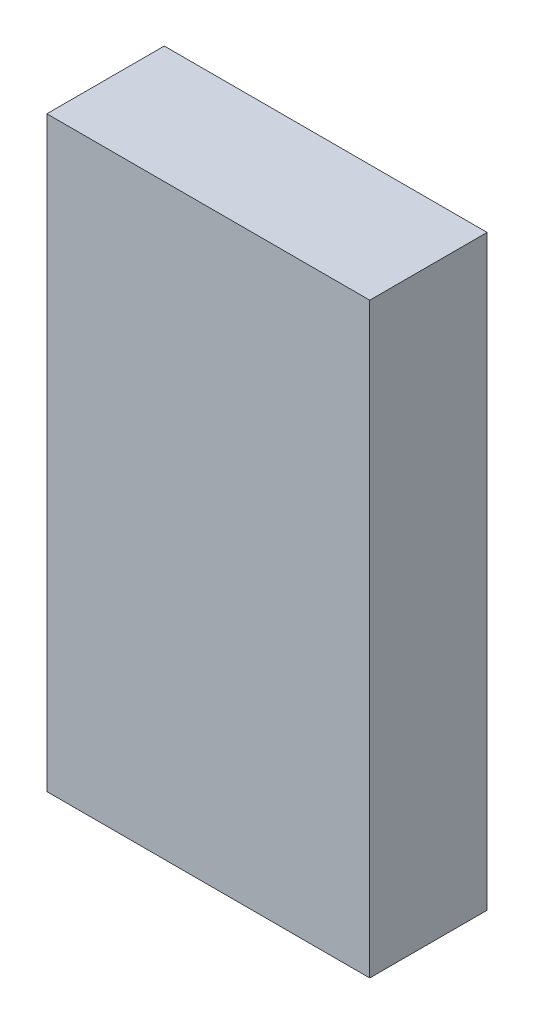
ISO-10303-21;
HEADER;
FILE_DESCRIPTION(('STEP AP214'),'2;1');
FILE_NAME('part.step','',(''),(''),'','','');
FILE_SCHEMA(('AUTOMOTIVE_DESIGN { 1 0 10303 214 1 1 1 1 }'));
ENDSEC;
DATA;
#1=APPLICATION_CONTEXT('core data for automotive mechanical design processes');
#2=APPLICATION_PROTOCOL_DEFINITION('international standard','automotive_design',2000,#1);
#3=PRODUCT_CONTEXT('',#1,'mechanical');
#4=PRODUCT('Part','Part','',(#3));
#5=PRODUCT_RELATED_PRODUCT_CATEGORY('part','',(#4));
#6=PRODUCT_DEFINITION_FORMATION('','',#4);
#7=PRODUCT_DEFINITION_CONTEXT('part definition',#1,'design');
#8=PRODUCT_DEFINITION('design','',#6,#7);
#9=PRODUCT_DEFINITION_SHAPE('','',#8);
#10=(LENGTH_UNIT() NAMED_UNIT(*) SI_UNIT(.MILLI.,.METRE.));
#11=(NAMED_UNIT(*) PLANE_ANGLE_UNIT() SI_UNIT($,.RADIAN.));
#12=(NAMED_UNIT(*) SI_UNIT($,.STERADIAN.) SOLID_ANGLE_UNIT());
#13=UNCERTAINTY_MEASURE_WITH_UNIT(LENGTH_MEASURE(1.E-05),#10,'distance_accuracy_value','');
#14=(GEOMETRIC_REPRESENTATION_CONTEXT(3) GLOBAL_UNCERTAINTY_ASSIGNED_CONTEXT((#13)) GLOBAL_UNIT_ASSIGNED_CONTEXT((#10,
#11,#12)) REPRESENTATION_CONTEXT('',''));
#15=CARTESIAN_POINT('',(0.,0.,0.));
#16=DIRECTION('',(0.,0.,1.));
#17=DIRECTION('',(1.,0.,0.));
#18=AXIS2_PLACEMENT_3D('',#15,#16,#17);
#19=CARTESIAN_POINT('',(-27.5,50.,20.));
#20=DIRECTION('',(1.,0.,0.));
#21=DIRECTION('',(0.,0.,-1.));
#22=AXIS2_PLACEMENT_3D('',#19,#20,#21);
#23=PLANE('',#22);
#24=DIRECTION('',(0.,-1.,0.));
#25=VECTOR('',#24,1.);
#26=CARTESIAN_POINT('',(-27.5,50.,0.));
#27=LINE('',#26,#25);
#28=CARTESIAN_POINT('',(-27.5,50.,0.));
#29=VERTEX_POINT('',#28);
#30=CARTESIAN_POINT('',(-27.5,-50.,0.));
#31=VERTEX_POINT('',#30);
#32=EDGE_CURVE('E96',#29,#31,#27,.T.);
#33=ORIENTED_EDGE('',*,*,#32,.T.);
#34=DIRECTION('',(0.,0.,-1.));
#35=VECTOR('',#34,1.);
#36=CARTESIAN_POINT('',(-27.5,-50.,20.));
#37=LINE('',#36,#35);
#38=CARTESIAN_POINT('',(-27.5,-50.,20.));
#39=VERTEX_POINT('',#38);
#40=EDGE_CURVE('E11',#39,#31,#37,.T.);
#41=ORIENTED_EDGE('',*,*,#40,.F.);
#42=DIRECTION('',(0.,-1.,0.));
#43=VECTOR('',#42,1.);
#44=CARTESIAN_POINT('',(-27.5,50.,20.));
#45=LINE('',#44,#43);
#46=CARTESIAN_POINT('',(-27.5,50.,20.));
#47=VERTEX_POINT('',#46);
#48=EDGE_CURVE('E84',#47,#39,#45,.T.);
#49=ORIENTED_EDGE('',*,*,#48,.F.);
#50=DIRECTION('',(0.,0.,-1.));
#51=VECTOR('',#50,1.);
#52=CARTESIAN_POINT('',(-27.5,50.,20.));
#53=LINE('',#52,#51);
#54=EDGE_CURVE('E92',#47,#29,#53,.T.);
#55=ORIENTED_EDGE('',*,*,#54,.T.);
#56=EDGE_LOOP('',(#33,#41,#49,#55));
#57=FACE_BOUND('',#56,.T.);
#58=ADVANCED_FACE('F33',(#57),#23,.F.);
#59=CARTESIAN_POINT('',(27.5,-50.,20.));
#60=DIRECTION('',(0.,1.,0.));
#61=DIRECTION('',(0.,0.,1.));
#62=AXIS2_PLACEMENT_3D('',#59,#60,#61);
#63=PLANE('',#62);
#64=DIRECTION('',(1.,0.,0.));
#65=VECTOR('',#64,1.);
#66=CARTESIAN_POINT('',(27.5,-50.,0.));
#67=LINE('',#66,#65);
#68=CARTESIAN_POINT('',(27.5,-50.,0.));
#69=VERTEX_POINT('',#68);
#70=EDGE_CURVE('E88',#31,#69,#67,.T.);
#71=ORIENTED_EDGE('',*,*,#70,.T.);
#72=DIRECTION('',(0.,0.,-1.));
#73=VECTOR('',#72,1.);
#74=CARTESIAN_POINT('',(27.5,-50.,20.));
#75=LINE('',#74,#73);
#76=CARTESIAN_POINT('',(27.5,-50.,20.));
#77=VERTEX_POINT('',#76);
#78=EDGE_CURVE('E41',#77,#69,#75,.T.);
#79=ORIENTED_EDGE('',*,*,#78,.F.);
#80=DIRECTION('',(1.,0.,0.));
#81=VECTOR('',#80,1.);
#82=CARTESIAN_POINT('',(27.5,-50.,20.));
#83=LINE('',#82,#81);
#84=EDGE_CURVE('E79',#39,#77,#83,.T.);
#85=ORIENTED_EDGE('',*,*,#84,.F.);
#86=ORIENTED_EDGE('',*,*,#40,.T.);
#87=EDGE_LOOP('',(#71,#79,#85,#86));
#88=FACE_BOUND('',#87,.T.);
#89=ADVANCED_FACE('F87',(#88),#63,.F.);
#90=CARTESIAN_POINT('',(27.5,50.,20.));
#91=DIRECTION('',(-1.,0.,0.));
#92=DIRECTION('',(0.,0.,1.));
#93=AXIS2_PLACEMENT_3D('',#90,#91,#92);
#94=PLANE('',#93);
#95=DIRECTION('',(0.,1.,0.));
#96=VECTOR('',#95,1.);
#97=CARTESIAN_POINT('',(27.5,50.,0.));
#98=LINE('',#97,#96);
#99=CARTESIAN_POINT('',(27.5,50.,0.));
#100=VERTEX_POINT('',#99);
#101=EDGE_CURVE('E66',#69,#100,#98,.T.);
#102=ORIENTED_EDGE('',*,*,#101,.T.);
#103=DIRECTION('',(0.,0.,-1.));
#104=VECTOR('',#103,1.);
#105=CARTESIAN_POINT('',(27.5,50.,20.));
#106=LINE('',#105,#104);
#107=CARTESIAN_POINT('',(27.5,50.,20.));
#108=VERTEX_POINT('',#107);
#109=EDGE_CURVE('E89',#108,#100,#106,.T.);
#110=ORIENTED_EDGE('',*,*,#109,.F.);
#111=DIRECTION('',(0.,1.,0.));
#112=VECTOR('',#111,1.);
#113=CARTESIAN_POINT('',(27.5,50.,20.));
#114=LINE('',#113,#112);
#115=EDGE_CURVE('E82',#77,#108,#114,.T.);
#116=ORIENTED_EDGE('',*,*,#115,.F.);
#117=ORIENTED_EDGE('',*,*,#78,.T.);
#118=EDGE_LOOP('',(#102,#110,#116,#117));
#119=FACE_BOUND('',#118,.T.);
#120=ADVANCED_FACE('F90',(#119),#94,.F.);
#121=CARTESIAN_POINT('',(27.5,50.,20.));
#122=DIRECTION('',(0.,-1.,0.));
#123=DIRECTION('',(0.,0.,-1.));
#124=AXIS2_PLACEMENT_3D('',#121,#122,#123);
#125=PLANE('',#124);
#126=DIRECTION('',(-1.,0.,0.));
#127=VECTOR('',#126,1.);
#128=CARTESIAN_POINT('',(27.5,50.,0.));
#129=LINE('',#128,#127);
#130=EDGE_CURVE('E72',#100,#29,#129,.T.);
#131=ORIENTED_EDGE('',*,*,#130,.T.);
#132=ORIENTED_EDGE('',*,*,#54,.F.);
#133=DIRECTION('',(-1.,0.,0.));
#134=VECTOR('',#133,1.);
#135=CARTESIAN_POINT('',(27.5,50.,20.));
#136=LINE('',#135,#134);
#137=EDGE_CURVE('E49',#108,#47,#136,.T.);
#138=ORIENTED_EDGE('',*,*,#137,.F.);
#139=ORIENTED_EDGE('',*,*,#109,.T.);
#140=EDGE_LOOP('',(#131,#132,#138,#139));
#141=FACE_BOUND('',#140,.T.);
#142=ADVANCED_FACE('F103',(#141),#125,.F.);
#143=CARTESIAN_POINT('',(0.,0.,20.));
#144=DIRECTION('',(0.,0.,-1.));
#145=DIRECTION('',(-1.,0.,0.));
#146=AXIS2_PLACEMENT_3D('',#143,#144,#145);
#147=PLANE('',#146);
#148=ORIENTED_EDGE('',*,*,#48,.T.);
#149=ORIENTED_EDGE('',*,*,#84,.T.);
#150=ORIENTED_EDGE('',*,*,#115,.T.);
#151=ORIENTED_EDGE('',*,*,#137,.T.);
#152=EDGE_LOOP('',(#148,#149,#150,#151));
#153=FACE_BOUND('',#152,.T.);
#154=ADVANCED_FACE('F80',(#153),#147,.F.);
#155=CARTESIAN_POINT('',(0.,0.,0.));
#156=DIRECTION('',(0.,0.,-1.));
#157=DIRECTION('',(-1.,0.,0.));
#158=AXIS2_PLACEMENT_3D('',#155,#156,#157);
#159=PLANE('',#158);
#160=ORIENTED_EDGE('',*,*,#32,.F.);
#161=ORIENTED_EDGE('',*,*,#130,.F.);
#162=ORIENTED_EDGE('',*,*,#101,.F.);
#163=ORIENTED_EDGE('',*,*,#70,.F.);
#164=EDGE_LOOP('',(#160,#161,#162,#163));
#165=FACE_BOUND('',#164,.T.);
#166=ADVANCED_FACE('F106',(#165),#159,.T.);
#167=CLOSED_SHELL('',(#58,#89,#120,#142,#154,#166));
#168=MANIFOLD_SOLID_BREP('B2',#167);
#169=ADVANCED_BREP_SHAPE_REPRESENTATION('',(#18,#168),#14);
#170=SHAPE_DEFINITION_REPRESENTATION(#9,#169);
ENDSEC;
END-ISO-10303-21;
